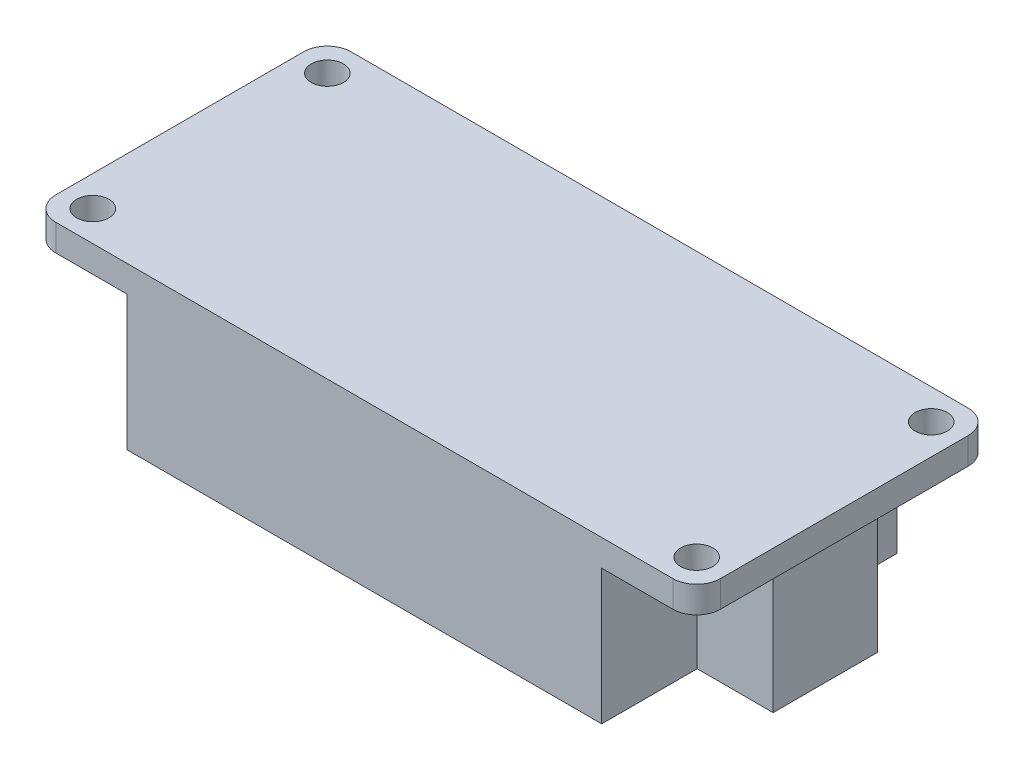
ISO-10303-21;
HEADER;
FILE_DESCRIPTION(('STEP AP214'),'2;1');
FILE_NAME('part.step','',(''),(''),'','','');
FILE_SCHEMA(('AUTOMOTIVE_DESIGN { 1 0 10303 214 1 1 1 1 }'));
ENDSEC;
DATA;
#1=APPLICATION_CONTEXT('core data for automotive mechanical design processes');
#2=APPLICATION_PROTOCOL_DEFINITION('international standard','automotive_design',2000,#1);
#3=PRODUCT_CONTEXT('',#1,'mechanical');
#4=PRODUCT('Part','Part','',(#3));
#5=PRODUCT_RELATED_PRODUCT_CATEGORY('part','',(#4));
#6=PRODUCT_DEFINITION_FORMATION('','',#4);
#7=PRODUCT_DEFINITION_CONTEXT('part definition',#1,'design');
#8=PRODUCT_DEFINITION('design','',#6,#7);
#9=PRODUCT_DEFINITION_SHAPE('','',#8);
#10=(LENGTH_UNIT() NAMED_UNIT(*) SI_UNIT(.MILLI.,.METRE.));
#11=(NAMED_UNIT(*) PLANE_ANGLE_UNIT() SI_UNIT($,.RADIAN.));
#12=(NAMED_UNIT(*) SI_UNIT($,.STERADIAN.) SOLID_ANGLE_UNIT());
#13=UNCERTAINTY_MEASURE_WITH_UNIT(LENGTH_MEASURE(1.E-05),#10,'distance_accuracy_value','');
#14=(GEOMETRIC_REPRESENTATION_CONTEXT(3) GLOBAL_UNCERTAINTY_ASSIGNED_CONTEXT((#13)) GLOBAL_UNIT_ASSIGNED_CONTEXT((#10,
#11,#12)) REPRESENTATION_CONTEXT('',''));
#15=CARTESIAN_POINT('',(0.,0.,0.));
#16=DIRECTION('',(0.,0.,1.));
#17=DIRECTION('',(1.,0.,0.));
#18=AXIS2_PLACEMENT_3D('',#15,#16,#17);
#19=CARTESIAN_POINT('',(0.,14.2,0.));
#20=DIRECTION('',(1.,0.,0.));
#21=DIRECTION('',(0.,0.,-1.));
#22=AXIS2_PLACEMENT_3D('',#19,#20,#21);
#23=PLANE('',#22);
#24=DIRECTION('',(0.,0.,1.));
#25=VECTOR('',#24,1.);
#26=CARTESIAN_POINT('',(0.,0.,0.));
#27=LINE('',#26,#25);
#28=CARTESIAN_POINT('',(0.,0.,-10.05));
#29=VERTEX_POINT('',#28);
#30=CARTESIAN_POINT('',(0.,0.,0.));
#31=VERTEX_POINT('',#30);
#32=EDGE_CURVE('E180',#29,#31,#27,.T.);
#33=ORIENTED_EDGE('',*,*,#32,.T.);
#34=DIRECTION('',(0.,-1.,0.));
#35=VECTOR('',#34,1.);
#36=CARTESIAN_POINT('',(0.,14.2,0.));
#37=LINE('',#36,#35);
#38=CARTESIAN_POINT('',(0.,14.2,0.));
#39=VERTEX_POINT('',#38);
#40=EDGE_CURVE('E11',#39,#31,#37,.T.);
#41=ORIENTED_EDGE('',*,*,#40,.F.);
#42=DIRECTION('',(0.,0.,1.));
#43=VECTOR('',#42,1.);
#44=CARTESIAN_POINT('',(0.,14.2,0.));
#45=LINE('',#44,#43);
#46=CARTESIAN_POINT('',(0.,14.2,-10.05));
#47=VERTEX_POINT('',#46);
#48=EDGE_CURVE('E202',#47,#39,#45,.T.);
#49=ORIENTED_EDGE('',*,*,#48,.F.);
#50=DIRECTION('',(0.,-1.,0.));
#51=VECTOR('',#50,1.);
#52=CARTESIAN_POINT('',(0.,14.2,-10.05));
#53=LINE('',#52,#51);
#54=EDGE_CURVE('E179',#47,#29,#53,.T.);
#55=ORIENTED_EDGE('',*,*,#54,.T.);
#56=EDGE_LOOP('',(#33,#41,#49,#55));
#57=FACE_BOUND('',#56,.T.);
#58=ADVANCED_FACE('F33',(#57),#23,.F.);
#59=CARTESIAN_POINT('',(0.,14.2,0.));
#60=DIRECTION('',(0.,0.,-1.));
#61=DIRECTION('',(-1.,0.,0.));
#62=AXIS2_PLACEMENT_3D('',#59,#60,#61);
#63=PLANE('',#62);
#64=DIRECTION('',(1.,0.,0.));
#65=VECTOR('',#64,1.);
#66=CARTESIAN_POINT('',(0.,0.,0.));
#67=LINE('',#66,#65);
#68=CARTESIAN_POINT('',(50.,0.,0.));
#69=VERTEX_POINT('',#68);
#70=EDGE_CURVE('E182',#31,#69,#67,.T.);
#71=ORIENTED_EDGE('',*,*,#70,.T.);
#72=DIRECTION('',(0.,-1.,0.));
#73=VECTOR('',#72,1.);
#74=CARTESIAN_POINT('',(50.,14.2,0.));
#75=LINE('',#74,#73);
#76=CARTESIAN_POINT('',(50.,14.2,0.));
#77=VERTEX_POINT('',#76);
#78=EDGE_CURVE('E42',#77,#69,#75,.T.);
#79=ORIENTED_EDGE('',*,*,#78,.F.);
#80=DIRECTION('',(1.,0.,0.));
#81=VECTOR('',#80,1.);
#82=CARTESIAN_POINT('',(57.5,14.2,0.));
#83=LINE('',#82,#81);
#84=CARTESIAN_POINT('',(57.5,14.2,0.));
#85=VERTEX_POINT('',#84);
#86=EDGE_CURVE('E250',#77,#85,#83,.T.);
#87=ORIENTED_EDGE('',*,*,#86,.T.);
#88=DIRECTION('',(0.,-1.,0.));
#89=VECTOR('',#88,1.);
#90=CARTESIAN_POINT('',(57.5,17.,0.));
#91=LINE('',#90,#89);
#92=CARTESIAN_POINT('',(57.5,17.,0.));
#93=VERTEX_POINT('',#92);
#94=EDGE_CURVE('E277',#93,#85,#91,.T.);
#95=ORIENTED_EDGE('',*,*,#94,.F.);
#96=DIRECTION('',(1.,0.,0.));
#97=VECTOR('',#96,1.);
#98=CARTESIAN_POINT('',(57.5,17.,0.));
#99=LINE('',#98,#97);
#100=CARTESIAN_POINT('',(-7.49999999999998,17.,0.));
#101=VERTEX_POINT('',#100);
#102=EDGE_CURVE('E377',#101,#93,#99,.T.);
#103=ORIENTED_EDGE('',*,*,#102,.F.);
#104=DIRECTION('',(0.,-1.,0.));
#105=VECTOR('',#104,1.);
#106=CARTESIAN_POINT('',(-7.49999999999998,17.,0.));
#107=LINE('',#106,#105);
#108=CARTESIAN_POINT('',(-7.49999999999998,14.2,0.));
#109=VERTEX_POINT('',#108);
#110=EDGE_CURVE('E247',#101,#109,#107,.T.);
#111=ORIENTED_EDGE('',*,*,#110,.T.);
#112=EDGE_CURVE('E243',#109,#39,#83,.T.);
#113=ORIENTED_EDGE('',*,*,#112,.T.);
#114=ORIENTED_EDGE('',*,*,#40,.T.);
#115=EDGE_LOOP('',(#71,#79,#87,#95,#103,#111,#113,#114));
#116=FACE_BOUND('',#115,.T.);
#117=ADVANCED_FACE('F241',(#116),#63,.F.);
#118=CARTESIAN_POINT('',(50.,14.2,0.));
#119=DIRECTION('',(-1.,0.,0.));
#120=DIRECTION('',(0.,0.,1.));
#121=AXIS2_PLACEMENT_3D('',#118,#119,#120);
#122=PLANE('',#121);
#123=DIRECTION('',(0.,0.,-1.));
#124=VECTOR('',#123,1.);
#125=CARTESIAN_POINT('',(50.,0.,0.));
#126=LINE('',#125,#124);
#127=CARTESIAN_POINT('',(50.,0.,-10.05));
#128=VERTEX_POINT('',#127);
#129=EDGE_CURVE('E185',#69,#128,#126,.T.);
#130=ORIENTED_EDGE('',*,*,#129,.T.);
#131=DIRECTION('',(0.,-1.,0.));
#132=VECTOR('',#131,1.);
#133=CARTESIAN_POINT('',(50.,14.2,-10.05));
#134=LINE('',#133,#132);
#135=CARTESIAN_POINT('',(50.,14.2,-10.05));
#136=VERTEX_POINT('',#135);
#137=EDGE_CURVE('E215',#136,#128,#134,.T.);
#138=ORIENTED_EDGE('',*,*,#137,.F.);
#139=DIRECTION('',(0.,0.,-1.));
#140=VECTOR('',#139,1.);
#141=CARTESIAN_POINT('',(50.,14.2,0.));
#142=LINE('',#141,#140);
#143=EDGE_CURVE('E660',#77,#136,#142,.T.);
#144=ORIENTED_EDGE('',*,*,#143,.F.);
#145=ORIENTED_EDGE('',*,*,#78,.T.);
#146=EDGE_LOOP('',(#130,#138,#144,#145));
#147=FACE_BOUND('',#146,.T.);
#148=ADVANCED_FACE('F434',(#147),#122,.F.);
#149=CARTESIAN_POINT('',(50.,14.2,-10.05));
#150=DIRECTION('',(0.,0.,-1.));
#151=DIRECTION('',(-1.,0.,0.));
#152=AXIS2_PLACEMENT_3D('',#149,#150,#151);
#153=PLANE('',#152);
#154=DIRECTION('',(1.,0.,0.));
#155=VECTOR('',#154,1.);
#156=CARTESIAN_POINT('',(50.,0.,-10.05));
#157=LINE('',#156,#155);
#158=CARTESIAN_POINT('',(58.,0.,-10.05));
#159=VERTEX_POINT('',#158);
#160=EDGE_CURVE('E187',#128,#159,#157,.T.);
#161=ORIENTED_EDGE('',*,*,#160,.T.);
#162=DIRECTION('',(0.,-1.,0.));
#163=VECTOR('',#162,1.);
#164=CARTESIAN_POINT('',(58.,14.2,-10.05));
#165=LINE('',#164,#163);
#166=CARTESIAN_POINT('',(58.,14.2,-10.05));
#167=VERTEX_POINT('',#166);
#168=EDGE_CURVE('E212',#167,#159,#165,.T.);
#169=ORIENTED_EDGE('',*,*,#168,.F.);
#170=DIRECTION('',(1.,0.,0.));
#171=VECTOR('',#170,1.);
#172=CARTESIAN_POINT('',(50.,14.2,-10.05));
#173=LINE('',#172,#171);
#174=EDGE_CURVE('E663',#136,#167,#173,.T.);
#175=ORIENTED_EDGE('',*,*,#174,.F.);
#176=ORIENTED_EDGE('',*,*,#137,.T.);
#177=EDGE_LOOP('',(#161,#169,#175,#176));
#178=FACE_BOUND('',#177,.T.);
#179=ADVANCED_FACE('F438',(#178),#153,.F.);
#180=CARTESIAN_POINT('',(58.,14.2,-21.05));
#181=DIRECTION('',(-1.,0.,0.));
#182=DIRECTION('',(0.,0.,1.));
#183=AXIS2_PLACEMENT_3D('',#180,#181,#182);
#184=PLANE('',#183);
#185=DIRECTION('',(0.,0.,-1.));
#186=VECTOR('',#185,1.);
#187=CARTESIAN_POINT('',(58.,0.,-21.05));
#188=LINE('',#187,#186);
#189=CARTESIAN_POINT('',(58.,0.,-21.05));
#190=VERTEX_POINT('',#189);
#191=EDGE_CURVE('E189',#159,#190,#188,.T.);
#192=ORIENTED_EDGE('',*,*,#191,.T.);
#193=DIRECTION('',(0.,-1.,0.));
#194=VECTOR('',#193,1.);
#195=CARTESIAN_POINT('',(58.,14.2,-21.05));
#196=LINE('',#195,#194);
#197=CARTESIAN_POINT('',(58.,14.2,-21.05));
#198=VERTEX_POINT('',#197);
#199=EDGE_CURVE('E209',#198,#190,#196,.T.);
#200=ORIENTED_EDGE('',*,*,#199,.F.);
#201=DIRECTION('',(0.,0.,-1.));
#202=VECTOR('',#201,1.);
#203=CARTESIAN_POINT('',(58.,14.2,-21.05));
#204=LINE('',#203,#202);
#205=EDGE_CURVE('E665',#167,#198,#204,.T.);
#206=ORIENTED_EDGE('',*,*,#205,.F.);
#207=ORIENTED_EDGE('',*,*,#168,.T.);
#208=EDGE_LOOP('',(#192,#200,#206,#207));
#209=FACE_BOUND('',#208,.T.);
#210=ADVANCED_FACE('F444',(#209),#184,.F.);
#211=CARTESIAN_POINT('',(50.,14.2,-21.05));
#212=DIRECTION('',(0.,0.,1.));
#213=DIRECTION('',(1.,0.,0.));
#214=AXIS2_PLACEMENT_3D('',#211,#212,#213);
#215=PLANE('',#214);
#216=DIRECTION('',(-1.,0.,0.));
#217=VECTOR('',#216,1.);
#218=CARTESIAN_POINT('',(50.,0.,-21.05));
#219=LINE('',#218,#217);
#220=CARTESIAN_POINT('',(50.,0.,-21.05));
#221=VERTEX_POINT('',#220);
#222=EDGE_CURVE('E191',#190,#221,#219,.T.);
#223=ORIENTED_EDGE('',*,*,#222,.T.);
#224=DIRECTION('',(0.,-1.,0.));
#225=VECTOR('',#224,1.);
#226=CARTESIAN_POINT('',(50.,14.2,-21.05));
#227=LINE('',#226,#225);
#228=CARTESIAN_POINT('',(50.,14.2,-21.05));
#229=VERTEX_POINT('',#228);
#230=EDGE_CURVE('E206',#229,#221,#227,.T.);
#231=ORIENTED_EDGE('',*,*,#230,.F.);
#232=DIRECTION('',(-1.,0.,0.));
#233=VECTOR('',#232,1.);
#234=CARTESIAN_POINT('',(50.,14.2,-21.05));
#235=LINE('',#234,#233);
#236=EDGE_CURVE('E161',#198,#229,#235,.T.);
#237=ORIENTED_EDGE('',*,*,#236,.F.);
#238=ORIENTED_EDGE('',*,*,#199,.T.);
#239=EDGE_LOOP('',(#223,#231,#237,#238));
#240=FACE_BOUND('',#239,.T.);
#241=ADVANCED_FACE('F448',(#240),#215,.F.);
#242=CARTESIAN_POINT('',(50.,14.2,-21.05));
#243=DIRECTION('',(-1.,0.,0.));
#244=DIRECTION('',(0.,0.,1.));
#245=AXIS2_PLACEMENT_3D('',#242,#243,#244);
#246=PLANE('',#245);
#247=DIRECTION('',(0.,0.,-1.));
#248=VECTOR('',#247,1.);
#249=CARTESIAN_POINT('',(50.,0.,-21.05));
#250=LINE('',#249,#248);
#251=CARTESIAN_POINT('',(50.,0.,-31.1));
#252=VERTEX_POINT('',#251);
#253=EDGE_CURVE('E193',#221,#252,#250,.T.);
#254=ORIENTED_EDGE('',*,*,#253,.T.);
#255=DIRECTION('',(0.,-1.,0.));
#256=VECTOR('',#255,1.);
#257=CARTESIAN_POINT('',(50.,14.2,-31.1));
#258=LINE('',#257,#256);
#259=CARTESIAN_POINT('',(50.,14.2,-31.1));
#260=VERTEX_POINT('',#259);
#261=EDGE_CURVE('E170',#260,#252,#258,.T.);
#262=ORIENTED_EDGE('',*,*,#261,.F.);
#263=DIRECTION('',(0.,0.,-1.));
#264=VECTOR('',#263,1.);
#265=CARTESIAN_POINT('',(50.,14.2,-21.05));
#266=LINE('',#265,#264);
#267=EDGE_CURVE('E158',#229,#260,#266,.T.);
#268=ORIENTED_EDGE('',*,*,#267,.F.);
#269=ORIENTED_EDGE('',*,*,#230,.T.);
#270=EDGE_LOOP('',(#254,#262,#268,#269));
#271=FACE_BOUND('',#270,.T.);
#272=ADVANCED_FACE('F452',(#271),#246,.F.);
#273=CARTESIAN_POINT('',(0.,14.2,-31.1));
#274=DIRECTION('',(0.,0.,1.));
#275=DIRECTION('',(1.,0.,0.));
#276=AXIS2_PLACEMENT_3D('',#273,#274,#275);
#277=PLANE('',#276);
#278=DIRECTION('',(-1.,0.,0.));
#279=VECTOR('',#278,1.);
#280=CARTESIAN_POINT('',(0.,0.,-31.1));
#281=LINE('',#280,#279);
#282=CARTESIAN_POINT('',(0.,0.,-31.1));
#283=VERTEX_POINT('',#282);
#284=EDGE_CURVE('E195',#252,#283,#281,.T.);
#285=ORIENTED_EDGE('',*,*,#284,.T.);
#286=DIRECTION('',(0.,-1.,0.));
#287=VECTOR('',#286,1.);
#288=CARTESIAN_POINT('',(0.,14.2,-31.1));
#289=LINE('',#288,#287);
#290=CARTESIAN_POINT('',(0.,14.2,-31.1));
#291=VERTEX_POINT('',#290);
#292=EDGE_CURVE('E143',#291,#283,#289,.T.);
#293=ORIENTED_EDGE('',*,*,#292,.F.);
#294=DIRECTION('',(-1.,0.,0.));
#295=VECTOR('',#294,1.);
#296=CARTESIAN_POINT('',(57.5,14.2,-31.1));
#297=LINE('',#296,#295);
#298=CARTESIAN_POINT('',(-7.49999999999998,14.2,-31.1));
#299=VERTEX_POINT('',#298);
#300=EDGE_CURVE('E157',#291,#299,#297,.T.);
#301=ORIENTED_EDGE('',*,*,#300,.T.);
#302=DIRECTION('',(0.,-1.,0.));
#303=VECTOR('',#302,1.);
#304=CARTESIAN_POINT('',(-7.49999999999998,17.,-31.1));
#305=LINE('',#304,#303);
#306=CARTESIAN_POINT('',(-7.49999999999998,17.,-31.1));
#307=VERTEX_POINT('',#306);
#308=EDGE_CURVE('E286',#307,#299,#305,.T.);
#309=ORIENTED_EDGE('',*,*,#308,.F.);
#310=DIRECTION('',(-1.,0.,0.));
#311=VECTOR('',#310,1.);
#312=CARTESIAN_POINT('',(57.5,17.,-31.1));
#313=LINE('',#312,#311);
#314=CARTESIAN_POINT('',(57.5,17.,-31.1));
#315=VERTEX_POINT('',#314);
#316=EDGE_CURVE('E299',#315,#307,#313,.T.);
#317=ORIENTED_EDGE('',*,*,#316,.F.);
#318=DIRECTION('',(0.,-1.,0.));
#319=VECTOR('',#318,1.);
#320=CARTESIAN_POINT('',(57.5,17.,-31.1));
#321=LINE('',#320,#319);
#322=CARTESIAN_POINT('',(57.5,14.2,-31.1));
#323=VERTEX_POINT('',#322);
#324=EDGE_CURVE('E183',#315,#323,#321,.T.);
#325=ORIENTED_EDGE('',*,*,#324,.T.);
#326=EDGE_CURVE('E224',#323,#260,#297,.T.);
#327=ORIENTED_EDGE('',*,*,#326,.T.);
#328=ORIENTED_EDGE('',*,*,#261,.T.);
#329=EDGE_LOOP('',(#285,#293,#301,#309,#317,#325,#327,#328));
#330=FACE_BOUND('',#329,.T.);
#331=ADVANCED_FACE('F221',(#330),#277,.F.);
#332=CARTESIAN_POINT('',(0.,14.2,-21.05));
#333=DIRECTION('',(1.,0.,0.));
#334=DIRECTION('',(0.,0.,-1.));
#335=AXIS2_PLACEMENT_3D('',#332,#333,#334);
#336=PLANE('',#335);
#337=DIRECTION('',(0.,0.,1.));
#338=VECTOR('',#337,1.);
#339=CARTESIAN_POINT('',(0.,0.,-21.05));
#340=LINE('',#339,#338);
#341=CARTESIAN_POINT('',(0.,0.,-21.05));
#342=VERTEX_POINT('',#341);
#343=EDGE_CURVE('E140',#283,#342,#340,.T.);
#344=ORIENTED_EDGE('',*,*,#343,.T.);
#345=DIRECTION('',(0.,-1.,0.));
#346=VECTOR('',#345,1.);
#347=CARTESIAN_POINT('',(0.,14.2,-21.05));
#348=LINE('',#347,#346);
#349=CARTESIAN_POINT('',(0.,14.2,-21.05));
#350=VERTEX_POINT('',#349);
#351=EDGE_CURVE('E132',#350,#342,#348,.T.);
#352=ORIENTED_EDGE('',*,*,#351,.F.);
#353=DIRECTION('',(0.,0.,1.));
#354=VECTOR('',#353,1.);
#355=CARTESIAN_POINT('',(0.,14.2,-21.05));
#356=LINE('',#355,#354);
#357=EDGE_CURVE('E137',#291,#350,#356,.T.);
#358=ORIENTED_EDGE('',*,*,#357,.F.);
#359=ORIENTED_EDGE('',*,*,#292,.T.);
#360=EDGE_LOOP('',(#344,#352,#358,#359));
#361=FACE_BOUND('',#360,.T.);
#362=ADVANCED_FACE('F134',(#361),#336,.F.);
#363=CARTESIAN_POINT('',(0.,14.2,-21.05));
#364=DIRECTION('',(0.,0.,1.));
#365=DIRECTION('',(1.,0.,0.));
#366=AXIS2_PLACEMENT_3D('',#363,#364,#365);
#367=PLANE('',#366);
#368=DIRECTION('',(-1.,0.,0.));
#369=VECTOR('',#368,1.);
#370=CARTESIAN_POINT('',(0.,0.,-21.05));
#371=LINE('',#370,#369);
#372=CARTESIAN_POINT('',(-8.00000000000001,0.,-21.05));
#373=VERTEX_POINT('',#372);
#374=EDGE_CURVE('E198',#342,#373,#371,.T.);
#375=ORIENTED_EDGE('',*,*,#374,.T.);
#376=DIRECTION('',(0.,-1.,0.));
#377=VECTOR('',#376,1.);
#378=CARTESIAN_POINT('',(-8.00000000000001,14.2,-21.05));
#379=LINE('',#378,#377);
#380=CARTESIAN_POINT('',(-8.00000000000001,14.2,-21.05));
#381=VERTEX_POINT('',#380);
#382=EDGE_CURVE('E144',#381,#373,#379,.T.);
#383=ORIENTED_EDGE('',*,*,#382,.F.);
#384=DIRECTION('',(-1.,0.,0.));
#385=VECTOR('',#384,1.);
#386=CARTESIAN_POINT('',(0.,14.2,-21.05));
#387=LINE('',#386,#385);
#388=EDGE_CURVE('E147',#350,#381,#387,.T.);
#389=ORIENTED_EDGE('',*,*,#388,.F.);
#390=ORIENTED_EDGE('',*,*,#351,.T.);
#391=EDGE_LOOP('',(#375,#383,#389,#390));
#392=FACE_BOUND('',#391,.T.);
#393=ADVANCED_FACE('F148',(#392),#367,.F.);
#394=CARTESIAN_POINT('',(-8.00000000000001,14.2,-21.05));
#395=DIRECTION('',(1.,0.,0.));
#396=DIRECTION('',(0.,0.,-1.));
#397=AXIS2_PLACEMENT_3D('',#394,#395,#396);
#398=PLANE('',#397);
#399=DIRECTION('',(0.,0.,1.));
#400=VECTOR('',#399,1.);
#401=CARTESIAN_POINT('',(-8.00000000000001,0.,-21.05));
#402=LINE('',#401,#400);
#403=CARTESIAN_POINT('',(-8.,0.,-10.05));
#404=VERTEX_POINT('',#403);
#405=EDGE_CURVE('E91',#373,#404,#402,.T.);
#406=ORIENTED_EDGE('',*,*,#405,.T.);
#407=DIRECTION('',(0.,-1.,0.));
#408=VECTOR('',#407,1.);
#409=CARTESIAN_POINT('',(-8.,14.2,-10.05));
#410=LINE('',#409,#408);
#411=CARTESIAN_POINT('',(-8.,14.2,-10.05));
#412=VERTEX_POINT('',#411);
#413=EDGE_CURVE('E51',#412,#404,#410,.T.);
#414=ORIENTED_EDGE('',*,*,#413,.F.);
#415=DIRECTION('',(0.,0.,1.));
#416=VECTOR('',#415,1.);
#417=CARTESIAN_POINT('',(-8.00000000000001,14.2,-21.05));
#418=LINE('',#417,#416);
#419=EDGE_CURVE('E151',#381,#412,#418,.T.);
#420=ORIENTED_EDGE('',*,*,#419,.F.);
#421=ORIENTED_EDGE('',*,*,#382,.T.);
#422=EDGE_LOOP('',(#406,#414,#420,#421));
#423=FACE_BOUND('',#422,.T.);
#424=ADVANCED_FACE('F232',(#423),#398,.F.);
#425=CARTESIAN_POINT('',(0.,14.2,-10.05));
#426=DIRECTION('',(0.,0.,-1.));
#427=DIRECTION('',(-1.,0.,0.));
#428=AXIS2_PLACEMENT_3D('',#425,#426,#427);
#429=PLANE('',#428);
#430=DIRECTION('',(1.,0.,0.));
#431=VECTOR('',#430,1.);
#432=CARTESIAN_POINT('',(0.,0.,-10.05));
#433=LINE('',#432,#431);
#434=EDGE_CURVE('E97',#404,#29,#433,.T.);
#435=ORIENTED_EDGE('',*,*,#434,.T.);
#436=ORIENTED_EDGE('',*,*,#54,.F.);
#437=DIRECTION('',(1.,0.,0.));
#438=VECTOR('',#437,1.);
#439=CARTESIAN_POINT('',(0.,14.2,-10.05));
#440=LINE('',#439,#438);
#441=EDGE_CURVE('E177',#412,#47,#440,.T.);
#442=ORIENTED_EDGE('',*,*,#441,.F.);
#443=ORIENTED_EDGE('',*,*,#413,.T.);
#444=EDGE_LOOP('',(#435,#436,#442,#443));
#445=FACE_BOUND('',#444,.T.);
#446=ADVANCED_FACE('F236',(#445),#429,.F.);
#447=CARTESIAN_POINT('',(0.,0.,0.));
#448=DIRECTION('',(0.,1.,0.));
#449=DIRECTION('',(0.,0.,1.));
#450=AXIS2_PLACEMENT_3D('',#447,#448,#449);
#451=PLANE('',#450);
#452=ORIENTED_EDGE('',*,*,#32,.F.);
#453=ORIENTED_EDGE('',*,*,#434,.F.);
#454=ORIENTED_EDGE('',*,*,#405,.F.);
#455=ORIENTED_EDGE('',*,*,#374,.F.);
#456=ORIENTED_EDGE('',*,*,#343,.F.);
#457=ORIENTED_EDGE('',*,*,#284,.F.);
#458=ORIENTED_EDGE('',*,*,#253,.F.);
#459=ORIENTED_EDGE('',*,*,#222,.F.);
#460=ORIENTED_EDGE('',*,*,#191,.F.);
#461=ORIENTED_EDGE('',*,*,#160,.F.);
#462=ORIENTED_EDGE('',*,*,#129,.F.);
#463=ORIENTED_EDGE('',*,*,#70,.F.);
#464=EDGE_LOOP('',(#452,#453,#454,#455,#456,#457,#458,#459,#460,#461,#462,#463));
#465=FACE_BOUND('',#464,.T.);
#466=ADVANCED_FACE('F230',(#465),#451,.F.);
#467=CARTESIAN_POINT('',(57.5,14.2,-28.6));
#468=DIRECTION('',(0.,-1.,0.));
#469=DIRECTION('',(0.,0.,-1.));
#470=AXIS2_PLACEMENT_3D('',#467,#468,#469);
#471=PLANE('',#470);
#472=CARTESIAN_POINT('',(56.8,14.2,-27.9));
#473=DIRECTION('',(0.,-1.,0.));
#474=DIRECTION('',(0.,0.,-1.));
#475=AXIS2_PLACEMENT_3D('',#472,#473,#474);
#476=CIRCLE('',#475,1.7);
#477=CARTESIAN_POINT('',(56.8,14.2,-29.6));
#478=VERTEX_POINT('',#477);
#479=EDGE_CURVE('E393',#478,#478,#476,.T.);
#480=ORIENTED_EDGE('',*,*,#479,.F.);
#481=EDGE_LOOP('',(#480));
#482=FACE_BOUND('',#481,.T.);
#483=CARTESIAN_POINT('',(56.8,14.2,-3.20000000000001));
#484=DIRECTION('',(0.,-1.,0.));
#485=DIRECTION('',(0.,0.,-1.));
#486=AXIS2_PLACEMENT_3D('',#483,#484,#485);
#487=CIRCLE('',#486,1.7);
#488=CARTESIAN_POINT('',(56.8,14.2,-4.90000000000001));
#489=VERTEX_POINT('',#488);
#490=EDGE_CURVE('E387',#489,#489,#487,.T.);
#491=ORIENTED_EDGE('',*,*,#490,.F.);
#492=EDGE_LOOP('',(#491));
#493=FACE_BOUND('',#492,.T.);
#494=ORIENTED_EDGE('',*,*,#86,.F.);
#495=ORIENTED_EDGE('',*,*,#143,.T.);
#496=ORIENTED_EDGE('',*,*,#174,.T.);
#497=ORIENTED_EDGE('',*,*,#205,.T.);
#498=ORIENTED_EDGE('',*,*,#236,.T.);
#499=ORIENTED_EDGE('',*,*,#267,.T.);
#500=ORIENTED_EDGE('',*,*,#326,.F.);
#501=CARTESIAN_POINT('',(57.5,14.2,-28.6));
#502=DIRECTION('',(0.,1.,0.));
#503=DIRECTION('',(0.,0.,-1.));
#504=AXIS2_PLACEMENT_3D('',#501,#502,#503);
#505=CIRCLE('',#504,2.5);
#506=CARTESIAN_POINT('',(60.,14.2,-28.6));
#507=VERTEX_POINT('',#506);
#508=EDGE_CURVE('E305',#507,#323,#505,.T.);
#509=ORIENTED_EDGE('',*,*,#508,.F.);
#510=DIRECTION('',(0.,0.,-1.));
#511=VECTOR('',#510,1.);
#512=CARTESIAN_POINT('',(60.,14.2,-28.6));
#513=LINE('',#512,#511);
#514=CARTESIAN_POINT('',(60.,14.2,-2.50000000000002));
#515=VERTEX_POINT('',#514);
#516=EDGE_CURVE('E253',#515,#507,#513,.T.);
#517=ORIENTED_EDGE('',*,*,#516,.F.);
#518=CARTESIAN_POINT('',(57.5,14.2,-2.5));
#519=DIRECTION('',(0.,1.,0.));
#520=DIRECTION('',(0.,0.,-1.));
#521=AXIS2_PLACEMENT_3D('',#518,#519,#520);
#522=CIRCLE('',#521,2.5);
#523=EDGE_CURVE('E249',#85,#515,#522,.T.);
#524=ORIENTED_EDGE('',*,*,#523,.F.);
#525=EDGE_LOOP('',(#494,#495,#496,#497,#498,#499,#500,#509,#517,#524));
#526=FACE_BOUND('',#525,.T.);
#527=ADVANCED_FACE('F412',(#482,#493,#526),#471,.T.);
#528=CARTESIAN_POINT('',(57.5,17.,-28.6));
#529=DIRECTION('',(0.,-1.,0.));
#530=DIRECTION('',(0.,0.,-1.));
#531=AXIS2_PLACEMENT_3D('',#528,#529,#530);
#532=CYLINDRICAL_SURFACE('',#531,2.5);
#533=ORIENTED_EDGE('',*,*,#508,.T.);
#534=ORIENTED_EDGE('',*,*,#324,.F.);
#535=CARTESIAN_POINT('',(57.5,17.,-28.6));
#536=DIRECTION('',(0.,1.,0.));
#537=DIRECTION('',(0.,0.,-1.));
#538=AXIS2_PLACEMENT_3D('',#535,#536,#537);
#539=CIRCLE('',#538,2.5);
#540=CARTESIAN_POINT('',(60.,17.,-28.6));
#541=VERTEX_POINT('',#540);
#542=EDGE_CURVE('E269',#541,#315,#539,.T.);
#543=ORIENTED_EDGE('',*,*,#542,.F.);
#544=DIRECTION('',(0.,-1.,0.));
#545=VECTOR('',#544,1.);
#546=CARTESIAN_POINT('',(60.,17.,-28.6));
#547=LINE('',#546,#545);
#548=EDGE_CURVE('E270',#541,#507,#547,.T.);
#549=ORIENTED_EDGE('',*,*,#548,.T.);
#550=EDGE_LOOP('',(#533,#534,#543,#549));
#551=FACE_BOUND('',#550,.T.);
#552=ADVANCED_FACE('F306',(#551),#532,.T.);
#553=CARTESIAN_POINT('',(-7.5,17.,-28.6));
#554=DIRECTION('',(0.,-1.,0.));
#555=DIRECTION('',(0.,0.,-1.));
#556=AXIS2_PLACEMENT_3D('',#553,#554,#555);
#557=CYLINDRICAL_SURFACE('',#556,2.5);
#558=CARTESIAN_POINT('',(-7.5,14.2,-28.6));
#559=DIRECTION('',(0.,1.,0.));
#560=DIRECTION('',(0.,0.,1.));
#561=AXIS2_PLACEMENT_3D('',#558,#559,#560);
#562=CIRCLE('',#561,2.5);
#563=CARTESIAN_POINT('',(-9.99999999999999,14.2,-28.6));
#564=VERTEX_POINT('',#563);
#565=EDGE_CURVE('E321',#299,#564,#562,.T.);
#566=ORIENTED_EDGE('',*,*,#565,.T.);
#567=DIRECTION('',(0.,-1.,0.));
#568=VECTOR('',#567,1.);
#569=CARTESIAN_POINT('',(-9.99999999999999,17.,-28.6));
#570=LINE('',#569,#568);
#571=CARTESIAN_POINT('',(-9.99999999999999,17.,-28.6));
#572=VERTEX_POINT('',#571);
#573=EDGE_CURVE('E284',#572,#564,#570,.T.);
#574=ORIENTED_EDGE('',*,*,#573,.F.);
#575=CARTESIAN_POINT('',(-7.5,17.,-28.6));
#576=DIRECTION('',(0.,1.,0.));
#577=DIRECTION('',(0.,0.,1.));
#578=AXIS2_PLACEMENT_3D('',#575,#576,#577);
#579=CIRCLE('',#578,2.5);
#580=EDGE_CURVE('E365',#307,#572,#579,.T.);
#581=ORIENTED_EDGE('',*,*,#580,.F.);
#582=ORIENTED_EDGE('',*,*,#308,.T.);
#583=EDGE_LOOP('',(#566,#574,#581,#582));
#584=FACE_BOUND('',#583,.T.);
#585=ADVANCED_FACE('F366',(#584),#557,.T.);
#586=CARTESIAN_POINT('',(-10.,17.,-28.6));
#587=DIRECTION('',(1.,0.,0.));
#588=DIRECTION('',(0.,0.,-1.));
#589=AXIS2_PLACEMENT_3D('',#586,#587,#588);
#590=PLANE('',#589);
#591=DIRECTION('',(0.,0.,1.));
#592=VECTOR('',#591,1.);
#593=CARTESIAN_POINT('',(-10.,14.2,-28.6));
#594=LINE('',#593,#592);
#595=CARTESIAN_POINT('',(-10.,14.2,-2.50000000000002));
#596=VERTEX_POINT('',#595);
#597=EDGE_CURVE('E324',#564,#596,#594,.T.);
#598=ORIENTED_EDGE('',*,*,#597,.T.);
#599=DIRECTION('',(0.,-1.,0.));
#600=VECTOR('',#599,1.);
#601=CARTESIAN_POINT('',(-10.,17.,-2.50000000000002));
#602=LINE('',#601,#600);
#603=CARTESIAN_POINT('',(-10.,17.,-2.50000000000002));
#604=VERTEX_POINT('',#603);
#605=EDGE_CURVE('E281',#604,#596,#602,.T.);
#606=ORIENTED_EDGE('',*,*,#605,.F.);
#607=DIRECTION('',(0.,0.,1.));
#608=VECTOR('',#607,1.);
#609=CARTESIAN_POINT('',(-10.,17.,-28.6));
#610=LINE('',#609,#608);
#611=EDGE_CURVE('E369',#572,#604,#610,.T.);
#612=ORIENTED_EDGE('',*,*,#611,.F.);
#613=ORIENTED_EDGE('',*,*,#573,.T.);
#614=EDGE_LOOP('',(#598,#606,#612,#613));
#615=FACE_BOUND('',#614,.T.);
#616=ADVANCED_FACE('F472',(#615),#590,.F.);
#617=CARTESIAN_POINT('',(-7.5,17.,-2.5));
#618=DIRECTION('',(0.,-1.,0.));
#619=DIRECTION('',(0.,0.,-1.));
#620=AXIS2_PLACEMENT_3D('',#617,#618,#619);
#621=CYLINDRICAL_SURFACE('',#620,2.5);
#622=CARTESIAN_POINT('',(-7.5,14.2,-2.5));
#623=DIRECTION('',(0.,1.,0.));
#624=DIRECTION('',(0.,0.,-1.));
#625=AXIS2_PLACEMENT_3D('',#622,#623,#624);
#626=CIRCLE('',#625,2.5);
#627=EDGE_CURVE('E256',#596,#109,#626,.T.);
#628=ORIENTED_EDGE('',*,*,#627,.T.);
#629=ORIENTED_EDGE('',*,*,#110,.F.);
#630=CARTESIAN_POINT('',(-7.5,17.,-2.5));
#631=DIRECTION('',(0.,1.,0.));
#632=DIRECTION('',(0.,0.,-1.));
#633=AXIS2_PLACEMENT_3D('',#630,#631,#632);
#634=CIRCLE('',#633,2.5);
#635=EDGE_CURVE('E371',#604,#101,#634,.T.);
#636=ORIENTED_EDGE('',*,*,#635,.F.);
#637=ORIENTED_EDGE('',*,*,#605,.T.);
#638=EDGE_LOOP('',(#628,#629,#636,#637));
#639=FACE_BOUND('',#638,.T.);
#640=ADVANCED_FACE('F334',(#639),#621,.T.);
#641=CARTESIAN_POINT('',(57.5,17.,-2.5));
#642=DIRECTION('',(0.,-1.,0.));
#643=DIRECTION('',(0.,0.,-1.));
#644=AXIS2_PLACEMENT_3D('',#641,#642,#643);
#645=CYLINDRICAL_SURFACE('',#644,2.5);
#646=ORIENTED_EDGE('',*,*,#523,.T.);
#647=DIRECTION('',(0.,-1.,0.));
#648=VECTOR('',#647,1.);
#649=CARTESIAN_POINT('',(60.,17.,-2.50000000000002));
#650=LINE('',#649,#648);
#651=CARTESIAN_POINT('',(60.,17.,-2.50000000000002));
#652=VERTEX_POINT('',#651);
#653=EDGE_CURVE('E273',#652,#515,#650,.T.);
#654=ORIENTED_EDGE('',*,*,#653,.F.);
#655=CARTESIAN_POINT('',(57.5,17.,-2.5));
#656=DIRECTION('',(0.,1.,0.));
#657=DIRECTION('',(0.,0.,-1.));
#658=AXIS2_PLACEMENT_3D('',#655,#656,#657);
#659=CIRCLE('',#658,2.5);
#660=EDGE_CURVE('E378',#93,#652,#659,.T.);
#661=ORIENTED_EDGE('',*,*,#660,.F.);
#662=ORIENTED_EDGE('',*,*,#94,.T.);
#663=EDGE_LOOP('',(#646,#654,#661,#662));
#664=FACE_BOUND('',#663,.T.);
#665=ADVANCED_FACE('F427',(#664),#645,.T.);
#666=CARTESIAN_POINT('',(60.,17.,-28.6));
#667=DIRECTION('',(-1.,0.,0.));
#668=DIRECTION('',(0.,0.,1.));
#669=AXIS2_PLACEMENT_3D('',#666,#667,#668);
#670=PLANE('',#669);
#671=ORIENTED_EDGE('',*,*,#516,.T.);
#672=ORIENTED_EDGE('',*,*,#548,.F.);
#673=DIRECTION('',(0.,0.,-1.));
#674=VECTOR('',#673,1.);
#675=CARTESIAN_POINT('',(60.,17.,-28.6));
#676=LINE('',#675,#674);
#677=EDGE_CURVE('E274',#652,#541,#676,.T.);
#678=ORIENTED_EDGE('',*,*,#677,.F.);
#679=ORIENTED_EDGE('',*,*,#653,.T.);
#680=EDGE_LOOP('',(#671,#672,#678,#679));
#681=FACE_BOUND('',#680,.T.);
#682=ADVANCED_FACE('F383',(#681),#670,.F.);
#683=CARTESIAN_POINT('',(57.5,17.,-28.6));
#684=DIRECTION('',(0.,-1.,0.));
#685=DIRECTION('',(0.,0.,-1.));
#686=AXIS2_PLACEMENT_3D('',#683,#684,#685);
#687=PLANE('',#686);
#688=CARTESIAN_POINT('',(-6.8,17.,-27.9));
#689=DIRECTION('',(0.,1.,0.));
#690=DIRECTION('',(0.,0.,1.));
#691=AXIS2_PLACEMENT_3D('',#688,#689,#690);
#692=CIRCLE('',#691,1.7);
#693=CARTESIAN_POINT('',(-6.8,17.,-26.2));
#694=VERTEX_POINT('',#693);
#695=EDGE_CURVE('E399',#694,#694,#692,.T.);
#696=ORIENTED_EDGE('',*,*,#695,.F.);
#697=EDGE_LOOP('',(#696));
#698=FACE_BOUND('',#697,.T.);
#699=CARTESIAN_POINT('',(56.8,17.,-27.9));
#700=DIRECTION('',(0.,1.,0.));
#701=DIRECTION('',(0.,0.,1.));
#702=AXIS2_PLACEMENT_3D('',#699,#700,#701);
#703=CIRCLE('',#702,1.7);
#704=CARTESIAN_POINT('',(56.8,17.,-26.2));
#705=VERTEX_POINT('',#704);
#706=EDGE_CURVE('E396',#705,#705,#703,.T.);
#707=ORIENTED_EDGE('',*,*,#706,.F.);
#708=EDGE_LOOP('',(#707));
#709=FACE_BOUND('',#708,.T.);
#710=CARTESIAN_POINT('',(56.8,17.,-3.20000000000001));
#711=DIRECTION('',(0.,1.,0.));
#712=DIRECTION('',(0.,0.,1.));
#713=AXIS2_PLACEMENT_3D('',#710,#711,#712);
#714=CIRCLE('',#713,1.7);
#715=CARTESIAN_POINT('',(56.8,17.,-1.50000000000001));
#716=VERTEX_POINT('',#715);
#717=EDGE_CURVE('E390',#716,#716,#714,.T.);
#718=ORIENTED_EDGE('',*,*,#717,.F.);
#719=EDGE_LOOP('',(#718));
#720=FACE_BOUND('',#719,.T.);
#721=CARTESIAN_POINT('',(-6.8,17.,-3.2));
#722=DIRECTION('',(0.,1.,0.));
#723=DIRECTION('',(0.,0.,1.));
#724=AXIS2_PLACEMENT_3D('',#721,#722,#723);
#725=CIRCLE('',#724,1.7);
#726=CARTESIAN_POINT('',(-6.8,17.,-1.5));
#727=VERTEX_POINT('',#726);
#728=EDGE_CURVE('E315',#727,#727,#725,.T.);
#729=ORIENTED_EDGE('',*,*,#728,.F.);
#730=EDGE_LOOP('',(#729));
#731=FACE_BOUND('',#730,.T.);
#732=ORIENTED_EDGE('',*,*,#542,.T.);
#733=ORIENTED_EDGE('',*,*,#316,.T.);
#734=ORIENTED_EDGE('',*,*,#580,.T.);
#735=ORIENTED_EDGE('',*,*,#611,.T.);
#736=ORIENTED_EDGE('',*,*,#635,.T.);
#737=ORIENTED_EDGE('',*,*,#102,.T.);
#738=ORIENTED_EDGE('',*,*,#660,.T.);
#739=ORIENTED_EDGE('',*,*,#677,.T.);
#740=EDGE_LOOP('',(#732,#733,#734,#735,#736,#737,#738,#739));
#741=FACE_BOUND('',#740,.T.);
#742=ADVANCED_FACE('F382',(#698,#709,#720,#731,#741),#687,.F.);
#743=CARTESIAN_POINT('',(-6.8,14.2,-27.9));
#744=DIRECTION('',(0.,-1.,0.));
#745=DIRECTION('',(0.,0.,-1.));
#746=AXIS2_PLACEMENT_3D('',#743,#744,#745);
#747=CIRCLE('',#746,1.7);
#748=CARTESIAN_POINT('',(-6.8,14.2,-29.6));
#749=VERTEX_POINT('',#748);
#750=EDGE_CURVE('E36',#749,#749,#747,.T.);
#751=ORIENTED_EDGE('',*,*,#750,.F.);
#752=EDGE_LOOP('',(#751));
#753=FACE_BOUND('',#752,.T.);
#754=CARTESIAN_POINT('',(-6.8,14.2,-3.2));
#755=DIRECTION('',(0.,-1.,0.));
#756=DIRECTION('',(0.,0.,-1.));
#757=AXIS2_PLACEMENT_3D('',#754,#755,#756);
#758=CIRCLE('',#757,1.7);
#759=CARTESIAN_POINT('',(-6.8,14.2,-4.9));
#760=VERTEX_POINT('',#759);
#761=EDGE_CURVE('E311',#760,#760,#758,.T.);
#762=ORIENTED_EDGE('',*,*,#761,.F.);
#763=EDGE_LOOP('',(#762));
#764=FACE_BOUND('',#763,.T.);
#765=ORIENTED_EDGE('',*,*,#441,.T.);
#766=ORIENTED_EDGE('',*,*,#48,.T.);
#767=ORIENTED_EDGE('',*,*,#112,.F.);
#768=ORIENTED_EDGE('',*,*,#627,.F.);
#769=ORIENTED_EDGE('',*,*,#597,.F.);
#770=ORIENTED_EDGE('',*,*,#565,.F.);
#771=ORIENTED_EDGE('',*,*,#300,.F.);
#772=ORIENTED_EDGE('',*,*,#357,.T.);
#773=ORIENTED_EDGE('',*,*,#388,.T.);
#774=ORIENTED_EDGE('',*,*,#419,.T.);
#775=EDGE_LOOP('',(#765,#766,#767,#768,#769,#770,#771,#772,#773,#774));
#776=FACE_BOUND('',#775,.T.);
#777=ADVANCED_FACE('F154',(#753,#764,#776),#471,.T.);
#778=CARTESIAN_POINT('',(-6.8,-2.50000000007189E-05,-3.2));
#779=DIRECTION('',(0.,1.,0.));
#780=DIRECTION('',(0.,0.,1.));
#781=AXIS2_PLACEMENT_3D('',#778,#779,#780);
#782=CYLINDRICAL_SURFACE('',#781,1.7);
#783=ORIENTED_EDGE('',*,*,#761,.T.);
#784=EDGE_LOOP('',(#783));
#785=FACE_BOUND('',#784,.T.);
#786=ORIENTED_EDGE('',*,*,#728,.T.);
#787=EDGE_LOOP('',(#786));
#788=FACE_BOUND('',#787,.T.);
#789=ADVANCED_FACE('F410',(#785,#788),#782,.F.);
#790=CARTESIAN_POINT('',(56.8,-2.50000000007189E-05,-3.20000000000001));
#791=DIRECTION('',(0.,1.,0.));
#792=DIRECTION('',(0.,0.,1.));
#793=AXIS2_PLACEMENT_3D('',#790,#791,#792);
#794=CYLINDRICAL_SURFACE('',#793,1.7);
#795=ORIENTED_EDGE('',*,*,#490,.T.);
#796=EDGE_LOOP('',(#795));
#797=FACE_BOUND('',#796,.T.);
#798=ORIENTED_EDGE('',*,*,#717,.T.);
#799=EDGE_LOOP('',(#798));
#800=FACE_BOUND('',#799,.T.);
#801=ADVANCED_FACE('F417',(#797,#800),#794,.F.);
#802=CARTESIAN_POINT('',(56.8,-2.50000000007189E-05,-27.9));
#803=DIRECTION('',(0.,1.,0.));
#804=DIRECTION('',(0.,0.,1.));
#805=AXIS2_PLACEMENT_3D('',#802,#803,#804);
#806=CYLINDRICAL_SURFACE('',#805,1.7);
#807=ORIENTED_EDGE('',*,*,#479,.T.);
#808=EDGE_LOOP('',(#807));
#809=FACE_BOUND('',#808,.T.);
#810=ORIENTED_EDGE('',*,*,#706,.T.);
#811=EDGE_LOOP('',(#810));
#812=FACE_BOUND('',#811,.T.);
#813=ADVANCED_FACE('F495',(#809,#812),#806,.F.);
#814=CARTESIAN_POINT('',(-6.8,-2.50000000007189E-05,-27.9));
#815=DIRECTION('',(0.,1.,0.));
#816=DIRECTION('',(0.,0.,1.));
#817=AXIS2_PLACEMENT_3D('',#814,#815,#816);
#818=CYLINDRICAL_SURFACE('',#817,1.7);
#819=ORIENTED_EDGE('',*,*,#750,.T.);
#820=EDGE_LOOP('',(#819));
#821=FACE_BOUND('',#820,.T.);
#822=ORIENTED_EDGE('',*,*,#695,.T.);
#823=EDGE_LOOP('',(#822));
#824=FACE_BOUND('',#823,.T.);
#825=ADVANCED_FACE('F406',(#821,#824),#818,.F.);
#826=CLOSED_SHELL('',(#58,#117,#148,#179,#210,#241,#272,#331,#362,#393,#424,#446,#466,#527,#552,
#585,#616,#640,#665,#682,#742,#777,#789,#801,#813,#825));
#827=MANIFOLD_SOLID_BREP('B2',#826);
#828=ADVANCED_BREP_SHAPE_REPRESENTATION('',(#18,#827),#14);
#829=SHAPE_DEFINITION_REPRESENTATION(#9,#828);
ENDSEC;
END-ISO-10303-21;
